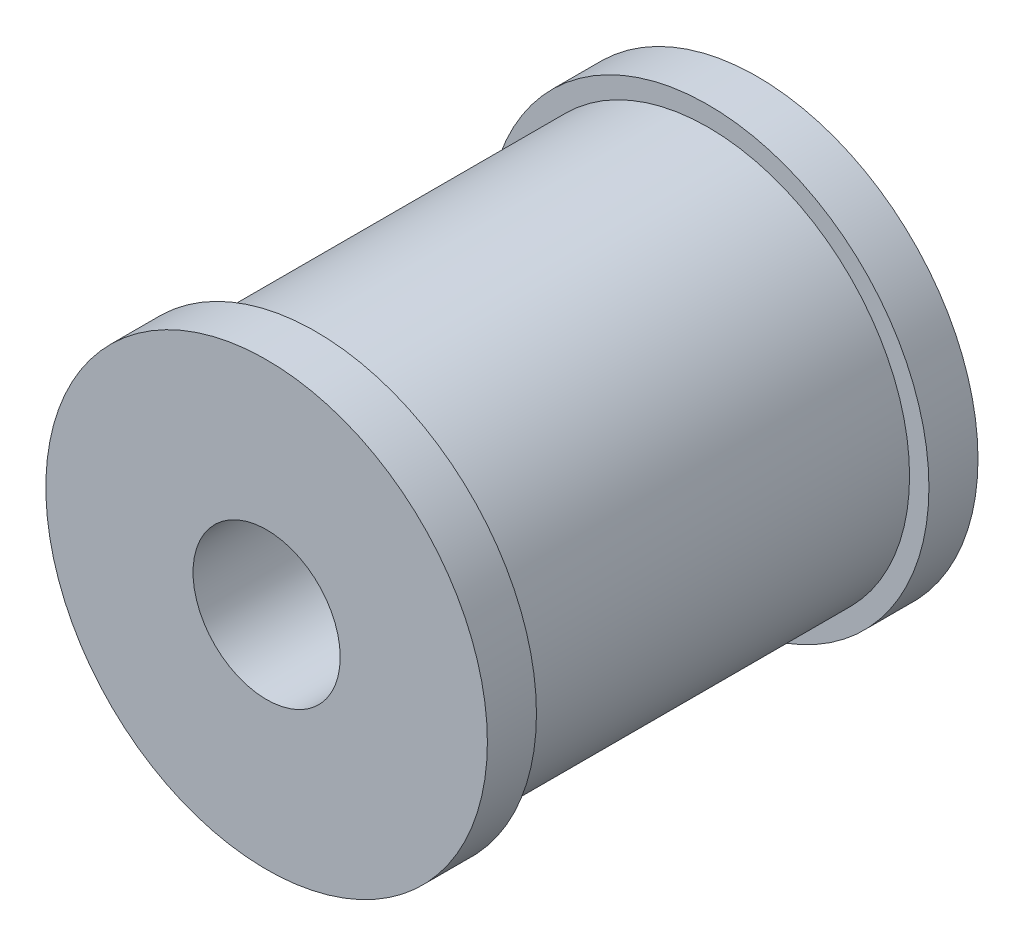
ISO-10303-21;
HEADER;
FILE_DESCRIPTION(('STEP AP214'),'2;1');
FILE_NAME('part.step','',(''),(''),'','','');
FILE_SCHEMA(('AUTOMOTIVE_DESIGN { 1 0 10303 214 1 1 1 1 }'));
ENDSEC;
DATA;
#1=APPLICATION_CONTEXT('core data for automotive mechanical design processes');
#2=APPLICATION_PROTOCOL_DEFINITION('international standard','automotive_design',2000,#1);
#3=PRODUCT_CONTEXT('',#1,'mechanical');
#4=PRODUCT('Part','Part','',(#3));
#5=PRODUCT_RELATED_PRODUCT_CATEGORY('part','',(#4));
#6=PRODUCT_DEFINITION_FORMATION('','',#4);
#7=PRODUCT_DEFINITION_CONTEXT('part definition',#1,'design');
#8=PRODUCT_DEFINITION('design','',#6,#7);
#9=PRODUCT_DEFINITION_SHAPE('','',#8);
#10=(LENGTH_UNIT() NAMED_UNIT(*) SI_UNIT(.MILLI.,.METRE.));
#11=(NAMED_UNIT(*) PLANE_ANGLE_UNIT() SI_UNIT($,.RADIAN.));
#12=(NAMED_UNIT(*) SI_UNIT($,.STERADIAN.) SOLID_ANGLE_UNIT());
#13=UNCERTAINTY_MEASURE_WITH_UNIT(LENGTH_MEASURE(1.E-05),#10,'distance_accuracy_value','');
#14=(GEOMETRIC_REPRESENTATION_CONTEXT(3) GLOBAL_UNCERTAINTY_ASSIGNED_CONTEXT((#13)) GLOBAL_UNIT_ASSIGNED_CONTEXT((#10,
#11,#12)) REPRESENTATION_CONTEXT('',''));
#15=CARTESIAN_POINT('',(0.,0.,0.));
#16=DIRECTION('',(0.,0.,1.));
#17=DIRECTION('',(1.,0.,0.));
#18=AXIS2_PLACEMENT_3D('',#15,#16,#17);
#19=CARTESIAN_POINT('',(0.,0.,20.));
#20=DIRECTION('',(0.,0.,-1.));
#21=DIRECTION('',(-1.,0.,0.));
#22=AXIS2_PLACEMENT_3D('',#19,#20,#21);
#23=CYLINDRICAL_SURFACE('',#22,9.);
#24=CARTESIAN_POINT('',(0.,0.,0.));
#25=DIRECTION('',(0.,0.,1.));
#26=DIRECTION('',(1.,0.,0.));
#27=AXIS2_PLACEMENT_3D('',#24,#25,#26);
#28=CIRCLE('',#27,9.);
#29=CARTESIAN_POINT('',(9.,0.,0.));
#30=VERTEX_POINT('',#29);
#31=EDGE_CURVE('E58',#30,#30,#28,.T.);
#32=ORIENTED_EDGE('',*,*,#31,.T.);
#33=EDGE_LOOP('',(#32));
#34=FACE_BOUND('',#33,.T.);
#35=CARTESIAN_POINT('',(0.,0.,2.));
#36=DIRECTION('',(0.,0.,1.));
#37=DIRECTION('',(1.,0.,0.));
#38=AXIS2_PLACEMENT_3D('',#35,#36,#37);
#39=CIRCLE('',#38,9.);
#40=CARTESIAN_POINT('',(9.,0.,2.));
#41=VERTEX_POINT('',#40);
#42=EDGE_CURVE('E69',#41,#41,#39,.T.);
#43=ORIENTED_EDGE('',*,*,#42,.F.);
#44=EDGE_LOOP('',(#43));
#45=FACE_BOUND('',#44,.T.);
#46=ADVANCED_FACE('F49',(#34,#45),#23,.T.);
#47=CARTESIAN_POINT('',(0.,0.,20.));
#48=DIRECTION('',(0.,0.,1.));
#49=DIRECTION('',(1.,0.,0.));
#50=AXIS2_PLACEMENT_3D('',#47,#48,#49);
#51=PLANE('',#50);
#52=CARTESIAN_POINT('',(0.,0.,20.));
#53=DIRECTION('',(0.,0.,1.));
#54=DIRECTION('',(1.,0.,0.));
#55=AXIS2_PLACEMENT_3D('',#52,#53,#54);
#56=CIRCLE('',#55,9.);
#57=CARTESIAN_POINT('',(9.,0.,20.));
#58=VERTEX_POINT('',#57);
#59=EDGE_CURVE('E11',#58,#58,#56,.T.);
#60=ORIENTED_EDGE('',*,*,#59,.T.);
#61=EDGE_LOOP('',(#60));
#62=FACE_BOUND('',#61,.T.);
#63=CARTESIAN_POINT('',(0.,0.,20.));
#64=DIRECTION('',(0.,0.,1.));
#65=DIRECTION('',(1.,0.,0.));
#66=AXIS2_PLACEMENT_3D('',#63,#64,#65);
#67=CIRCLE('',#66,3.);
#68=CARTESIAN_POINT('',(3.,0.,20.));
#69=VERTEX_POINT('',#68);
#70=EDGE_CURVE('E64',#69,#69,#67,.T.);
#71=ORIENTED_EDGE('',*,*,#70,.F.);
#72=EDGE_LOOP('',(#71));
#73=FACE_BOUND('',#72,.T.);
#74=ADVANCED_FACE('F109',(#62,#73),#51,.T.);
#75=CARTESIAN_POINT('',(0.,0.,0.));
#76=DIRECTION('',(0.,0.,1.));
#77=DIRECTION('',(1.,0.,0.));
#78=AXIS2_PLACEMENT_3D('',#75,#76,#77);
#79=PLANE('',#78);
#80=ORIENTED_EDGE('',*,*,#31,.F.);
#81=EDGE_LOOP('',(#80));
#82=FACE_BOUND('',#81,.T.);
#83=CARTESIAN_POINT('',(0.,0.,0.));
#84=DIRECTION('',(0.,0.,1.));
#85=DIRECTION('',(1.,0.,0.));
#86=AXIS2_PLACEMENT_3D('',#83,#84,#85);
#87=CIRCLE('',#86,3.);
#88=CARTESIAN_POINT('',(3.,0.,0.));
#89=VERTEX_POINT('',#88);
#90=EDGE_CURVE('E67',#89,#89,#87,.T.);
#91=ORIENTED_EDGE('',*,*,#90,.T.);
#92=EDGE_LOOP('',(#91));
#93=FACE_BOUND('',#92,.T.);
#94=ADVANCED_FACE('F94',(#82,#93),#79,.F.);
#95=CARTESIAN_POINT('',(0.,0.,18.));
#96=DIRECTION('',(0.,0.,1.));
#97=DIRECTION('',(1.,0.,0.));
#98=AXIS2_PLACEMENT_3D('',#95,#96,#97);
#99=CIRCLE('',#98,9.);
#100=CARTESIAN_POINT('',(9.,0.,18.));
#101=VERTEX_POINT('',#100);
#102=EDGE_CURVE('E53',#101,#101,#99,.T.);
#103=ORIENTED_EDGE('',*,*,#102,.T.);
#104=EDGE_LOOP('',(#103));
#105=FACE_BOUND('',#104,.T.);
#106=ORIENTED_EDGE('',*,*,#59,.F.);
#107=EDGE_LOOP('',(#106));
#108=FACE_BOUND('',#107,.T.);
#109=ADVANCED_FACE('F51',(#105,#108),#23,.T.);
#110=CARTESIAN_POINT('',(0.,0.,20.));
#111=DIRECTION('',(0.,0.,-1.));
#112=DIRECTION('',(-1.,0.,0.));
#113=AXIS2_PLACEMENT_3D('',#110,#111,#112);
#114=CYLINDRICAL_SURFACE('',#113,3.);
#115=ORIENTED_EDGE('',*,*,#70,.T.);
#116=EDGE_LOOP('',(#115));
#117=FACE_BOUND('',#116,.T.);
#118=ORIENTED_EDGE('',*,*,#90,.F.);
#119=EDGE_LOOP('',(#118));
#120=FACE_BOUND('',#119,.T.);
#121=ADVANCED_FACE('F96',(#117,#120),#114,.F.);
#122=CARTESIAN_POINT('',(0.,0.,18.));
#123=DIRECTION('',(0.,0.,1.));
#124=DIRECTION('',(1.,0.,0.));
#125=AXIS2_PLACEMENT_3D('',#122,#123,#124);
#126=PLANE('',#125);
#127=CARTESIAN_POINT('',(0.,0.,18.));
#128=DIRECTION('',(0.,0.,1.));
#129=DIRECTION('',(1.,0.,0.));
#130=AXIS2_PLACEMENT_3D('',#127,#128,#129);
#131=CIRCLE('',#130,8.21);
#132=CARTESIAN_POINT('',(8.21,0.,18.));
#133=VERTEX_POINT('',#132);
#134=EDGE_CURVE('E72',#133,#133,#131,.T.);
#135=ORIENTED_EDGE('',*,*,#134,.T.);
#136=EDGE_LOOP('',(#135));
#137=FACE_BOUND('',#136,.T.);
#138=ORIENTED_EDGE('',*,*,#102,.F.);
#139=EDGE_LOOP('',(#138));
#140=FACE_BOUND('',#139,.T.);
#141=ADVANCED_FACE('F98',(#137,#140),#126,.F.);
#142=CARTESIAN_POINT('',(0.,0.,2.));
#143=DIRECTION('',(0.,0.,1.));
#144=DIRECTION('',(1.,0.,0.));
#145=AXIS2_PLACEMENT_3D('',#142,#143,#144);
#146=PLANE('',#145);
#147=CARTESIAN_POINT('',(0.,0.,2.));
#148=DIRECTION('',(0.,0.,1.));
#149=DIRECTION('',(1.,0.,0.));
#150=AXIS2_PLACEMENT_3D('',#147,#148,#149);
#151=CIRCLE('',#150,8.21);
#152=CARTESIAN_POINT('',(8.21,0.,2.));
#153=VERTEX_POINT('',#152);
#154=EDGE_CURVE('E79',#153,#153,#151,.T.);
#155=ORIENTED_EDGE('',*,*,#154,.F.);
#156=EDGE_LOOP('',(#155));
#157=FACE_BOUND('',#156,.T.);
#158=ORIENTED_EDGE('',*,*,#42,.T.);
#159=EDGE_LOOP('',(#158));
#160=FACE_BOUND('',#159,.T.);
#161=ADVANCED_FACE('F104',(#157,#160),#146,.T.);
#162=CARTESIAN_POINT('',(0.,0.,18.));
#163=DIRECTION('',(0.,0.,-1.));
#164=DIRECTION('',(-1.,0.,0.));
#165=AXIS2_PLACEMENT_3D('',#162,#163,#164);
#166=CYLINDRICAL_SURFACE('',#165,8.21);
#167=ORIENTED_EDGE('',*,*,#134,.F.);
#168=EDGE_LOOP('',(#167));
#169=FACE_BOUND('',#168,.T.);
#170=ORIENTED_EDGE('',*,*,#154,.T.);
#171=EDGE_LOOP('',(#170));
#172=FACE_BOUND('',#171,.T.);
#173=ADVANCED_FACE('F144',(#169,#172),#166,.T.);
#174=CLOSED_SHELL('',(#46,#74,#94,#109,#121,#141,#161,#173));
#175=MANIFOLD_SOLID_BREP('B2',#174);
#176=ADVANCED_BREP_SHAPE_REPRESENTATION('',(#18,#175),#14);
#177=SHAPE_DEFINITION_REPRESENTATION(#9,#176);
ENDSEC;
END-ISO-10303-21;
